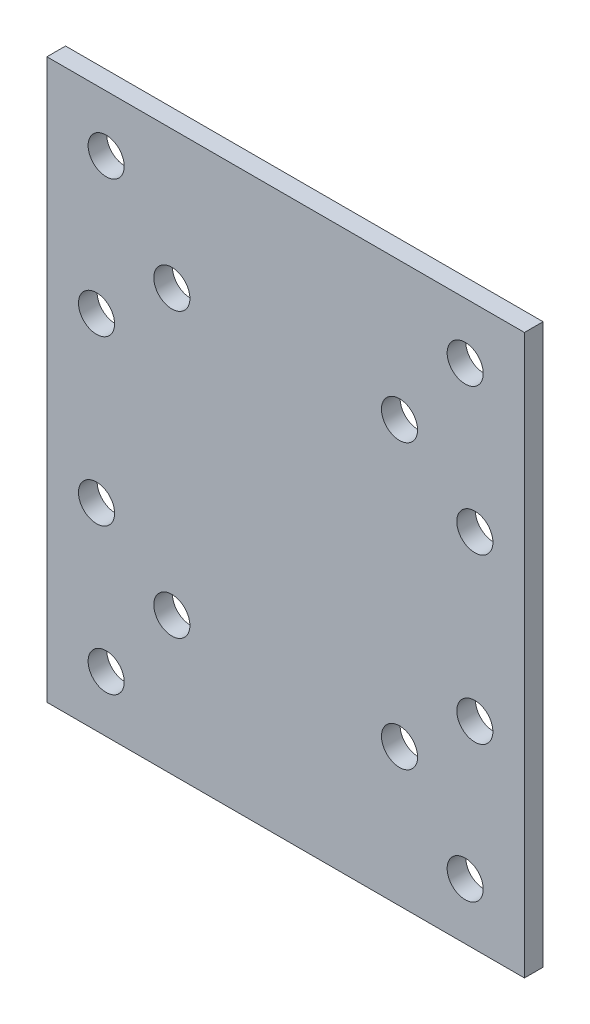
ISO-10303-21;
HEADER;
FILE_DESCRIPTION(('STEP AP214'),'2;1');
FILE_NAME('part.step','',(''),(''),'','','');
FILE_SCHEMA(('AUTOMOTIVE_DESIGN { 1 0 10303 214 1 1 1 1 }'));
ENDSEC;
DATA;
#1=APPLICATION_CONTEXT('core data for automotive mechanical design processes');
#2=APPLICATION_PROTOCOL_DEFINITION('international standard','automotive_design',2000,#1);
#3=PRODUCT_CONTEXT('',#1,'mechanical');
#4=PRODUCT('Part','Part','',(#3));
#5=PRODUCT_RELATED_PRODUCT_CATEGORY('part','',(#4));
#6=PRODUCT_DEFINITION_FORMATION('','',#4);
#7=PRODUCT_DEFINITION_CONTEXT('part definition',#1,'design');
#8=PRODUCT_DEFINITION('design','',#6,#7);
#9=PRODUCT_DEFINITION_SHAPE('','',#8);
#10=(LENGTH_UNIT() NAMED_UNIT(*) SI_UNIT(.MILLI.,.METRE.));
#11=(NAMED_UNIT(*) PLANE_ANGLE_UNIT() SI_UNIT($,.RADIAN.));
#12=(NAMED_UNIT(*) SI_UNIT($,.STERADIAN.) SOLID_ANGLE_UNIT());
#13=UNCERTAINTY_MEASURE_WITH_UNIT(LENGTH_MEASURE(1.E-05),#10,'distance_accuracy_value','');
#14=(GEOMETRIC_REPRESENTATION_CONTEXT(3) GLOBAL_UNCERTAINTY_ASSIGNED_CONTEXT((#13)) GLOBAL_UNIT_ASSIGNED_CONTEXT((#10,
#11,#12)) REPRESENTATION_CONTEXT('',''));
#15=CARTESIAN_POINT('',(0.,0.,0.));
#16=DIRECTION('',(0.,0.,1.));
#17=DIRECTION('',(1.,0.,0.));
#18=AXIS2_PLACEMENT_3D('',#15,#16,#17);
#19=CARTESIAN_POINT('',(0.,480.,16.));
#20=DIRECTION('',(0.,0.,-1.));
#21=DIRECTION('',(-1.,0.,0.));
#22=AXIS2_PLACEMENT_3D('',#19,#20,#21);
#23=PLANE('',#22);
#24=CARTESIAN_POINT('',(302.738221798083,361.586347916815,16.));
#25=DIRECTION('',(0.,0.,1.));
#26=DIRECTION('',(1.,0.,0.));
#27=AXIS2_PLACEMENT_3D('',#24,#25,#26);
#28=CIRCLE('',#27,15.5);
#29=CARTESIAN_POINT('',(318.238221798083,361.586347916815,16.));
#30=VERTEX_POINT('',#29);
#31=EDGE_CURVE('E166',#30,#30,#28,.T.);
#32=ORIENTED_EDGE('',*,*,#31,.F.);
#33=EDGE_LOOP('',(#32));
#34=FACE_BOUND('',#33,.T.);
#35=CARTESIAN_POINT('',(107.261778201917,361.586347916815,16.));
#36=DIRECTION('',(0.,0.,1.));
#37=DIRECTION('',(-1.,0.,0.));
#38=AXIS2_PLACEMENT_3D('',#35,#36,#37);
#39=CIRCLE('',#38,15.5);
#40=CARTESIAN_POINT('',(91.7617782019172,361.586347916815,16.));
#41=VERTEX_POINT('',#40);
#42=EDGE_CURVE('E154',#41,#41,#39,.T.);
#43=ORIENTED_EDGE('',*,*,#42,.F.);
#44=EDGE_LOOP('',(#43));
#45=FACE_BOUND('',#44,.T.);
#46=CARTESIAN_POINT('',(367.40218869963,169.611584010082,16.));
#47=DIRECTION('',(0.,0.,1.));
#48=DIRECTION('',(-1.,0.,0.));
#49=AXIS2_PLACEMENT_3D('',#46,#47,#48);
#50=CIRCLE('',#49,15.5);
#51=CARTESIAN_POINT('',(351.90218869963,169.611584010082,16.));
#52=VERTEX_POINT('',#51);
#53=EDGE_CURVE('E142',#52,#52,#50,.T.);
#54=ORIENTED_EDGE('',*,*,#53,.F.);
#55=EDGE_LOOP('',(#54));
#56=FACE_BOUND('',#55,.T.);
#57=CARTESIAN_POINT('',(359.125657450823,48.2676821311762,16.));
#58=DIRECTION('',(0.,0.,1.));
#59=DIRECTION('',(-1.,0.,0.));
#60=AXIS2_PLACEMENT_3D('',#57,#58,#59);
#61=CIRCLE('',#60,15.5000000000001);
#62=CARTESIAN_POINT('',(343.625657450823,48.2676821311762,16.));
#63=VERTEX_POINT('',#62);
#64=EDGE_CURVE('E130',#63,#63,#61,.T.);
#65=ORIENTED_EDGE('',*,*,#64,.F.);
#66=EDGE_LOOP('',(#65));
#67=FACE_BOUND('',#66,.T.);
#68=CARTESIAN_POINT('',(50.8743425491773,48.2676821311762,16.));
#69=DIRECTION('',(0.,0.,1.));
#70=DIRECTION('',(1.,0.,0.));
#71=AXIS2_PLACEMENT_3D('',#68,#69,#70);
#72=CIRCLE('',#71,15.5);
#73=CARTESIAN_POINT('',(66.3743425491773,48.2676821311762,16.));
#74=VERTEX_POINT('',#73);
#75=EDGE_CURVE('E118',#74,#74,#72,.T.);
#76=ORIENTED_EDGE('',*,*,#75,.F.);
#77=EDGE_LOOP('',(#76));
#78=FACE_BOUND('',#77,.T.);
#79=CARTESIAN_POINT('',(367.40218869963,310.388415989918,16.));
#80=DIRECTION('',(0.,0.,1.));
#81=DIRECTION('',(1.,0.,0.));
#82=AXIS2_PLACEMENT_3D('',#79,#80,#81);
#83=CIRCLE('',#82,15.5);
#84=CARTESIAN_POINT('',(382.90218869963,310.388415989918,16.));
#85=VERTEX_POINT('',#84);
#86=EDGE_CURVE('E97',#85,#85,#83,.T.);
#87=ORIENTED_EDGE('',*,*,#86,.F.);
#88=EDGE_LOOP('',(#87));
#89=FACE_BOUND('',#88,.T.);
#90=DIRECTION('',(0.,-1.,0.));
#91=VECTOR('',#90,1.);
#92=CARTESIAN_POINT('',(0.,0.,16.));
#93=LINE('',#92,#91);
#94=CARTESIAN_POINT('',(0.,480.,16.));
#95=VERTEX_POINT('',#94);
#96=CARTESIAN_POINT('',(0.,0.,16.));
#97=VERTEX_POINT('',#96);
#98=EDGE_CURVE('E82',#95,#97,#93,.T.);
#99=ORIENTED_EDGE('',*,*,#98,.T.);
#100=DIRECTION('',(1.,0.,0.));
#101=VECTOR('',#100,1.);
#102=CARTESIAN_POINT('',(0.,0.,16.));
#103=LINE('',#102,#101);
#104=CARTESIAN_POINT('',(410.,0.,16.));
#105=VERTEX_POINT('',#104);
#106=EDGE_CURVE('E77',#97,#105,#103,.T.);
#107=ORIENTED_EDGE('',*,*,#106,.T.);
#108=DIRECTION('',(0.,1.,0.));
#109=VECTOR('',#108,1.);
#110=CARTESIAN_POINT('',(410.,0.,16.));
#111=LINE('',#110,#109);
#112=CARTESIAN_POINT('',(410.,480.,16.));
#113=VERTEX_POINT('',#112);
#114=EDGE_CURVE('E80',#105,#113,#111,.T.);
#115=ORIENTED_EDGE('',*,*,#114,.T.);
#116=DIRECTION('',(-1.,0.,0.));
#117=VECTOR('',#116,1.);
#118=CARTESIAN_POINT('',(0.,480.,16.));
#119=LINE('',#118,#117);
#120=EDGE_CURVE('E47',#113,#95,#119,.T.);
#121=ORIENTED_EDGE('',*,*,#120,.T.);
#122=EDGE_LOOP('',(#99,#107,#115,#121));
#123=FACE_BOUND('',#122,.T.);
#124=CARTESIAN_POINT('',(107.261778201917,118.413652083185,16.));
#125=DIRECTION('',(0.,0.,1.));
#126=DIRECTION('',(1.,0.,0.));
#127=AXIS2_PLACEMENT_3D('',#124,#125,#126);
#128=CIRCLE('',#127,15.5);
#129=CARTESIAN_POINT('',(122.761778201917,118.413652083185,16.));
#130=VERTEX_POINT('',#129);
#131=EDGE_CURVE('E112',#130,#130,#128,.T.);
#132=ORIENTED_EDGE('',*,*,#131,.F.);
#133=EDGE_LOOP('',(#132));
#134=FACE_BOUND('',#133,.T.);
#135=CARTESIAN_POINT('',(42.5978113003698,310.388415989918,16.));
#136=DIRECTION('',(0.,0.,1.));
#137=DIRECTION('',(-1.,0.,0.));
#138=AXIS2_PLACEMENT_3D('',#135,#136,#137);
#139=CIRCLE('',#138,15.5);
#140=CARTESIAN_POINT('',(27.0978113003698,310.388415989918,16.));
#141=VERTEX_POINT('',#140);
#142=EDGE_CURVE('E124',#141,#141,#139,.T.);
#143=ORIENTED_EDGE('',*,*,#142,.F.);
#144=EDGE_LOOP('',(#143));
#145=FACE_BOUND('',#144,.T.);
#146=CARTESIAN_POINT('',(302.738221798083,118.413652083185,16.));
#147=DIRECTION('',(0.,0.,1.));
#148=DIRECTION('',(-1.,0.,0.));
#149=AXIS2_PLACEMENT_3D('',#146,#147,#148);
#150=CIRCLE('',#149,15.5);
#151=CARTESIAN_POINT('',(287.238221798083,118.413652083185,16.));
#152=VERTEX_POINT('',#151);
#153=EDGE_CURVE('E136',#152,#152,#150,.T.);
#154=ORIENTED_EDGE('',*,*,#153,.F.);
#155=EDGE_LOOP('',(#154));
#156=FACE_BOUND('',#155,.T.);
#157=CARTESIAN_POINT('',(50.8743425491773,431.732317868824,16.));
#158=DIRECTION('',(0.,0.,1.));
#159=DIRECTION('',(-1.,0.,0.));
#160=AXIS2_PLACEMENT_3D('',#157,#158,#159);
#161=CIRCLE('',#160,15.5);
#162=CARTESIAN_POINT('',(35.3743425491773,431.732317868824,16.));
#163=VERTEX_POINT('',#162);
#164=EDGE_CURVE('E148',#163,#163,#161,.T.);
#165=ORIENTED_EDGE('',*,*,#164,.F.);
#166=EDGE_LOOP('',(#165));
#167=FACE_BOUND('',#166,.T.);
#168=CARTESIAN_POINT('',(42.5978113003698,169.611584010082,16.));
#169=DIRECTION('',(0.,0.,1.));
#170=DIRECTION('',(1.,0.,0.));
#171=AXIS2_PLACEMENT_3D('',#168,#169,#170);
#172=CIRCLE('',#171,15.5);
#173=CARTESIAN_POINT('',(58.0978113003698,169.611584010082,16.));
#174=VERTEX_POINT('',#173);
#175=EDGE_CURVE('E160',#174,#174,#172,.T.);
#176=ORIENTED_EDGE('',*,*,#175,.F.);
#177=EDGE_LOOP('',(#176));
#178=FACE_BOUND('',#177,.T.);
#179=CARTESIAN_POINT('',(359.125657450823,431.732317868824,16.));
#180=DIRECTION('',(0.,0.,1.));
#181=DIRECTION('',(1.,0.,0.));
#182=AXIS2_PLACEMENT_3D('',#179,#180,#181);
#183=CIRCLE('',#182,15.5000000000001);
#184=CARTESIAN_POINT('',(374.625657450823,431.732317868824,16.));
#185=VERTEX_POINT('',#184);
#186=EDGE_CURVE('E172',#185,#185,#183,.T.);
#187=ORIENTED_EDGE('',*,*,#186,.F.);
#188=EDGE_LOOP('',(#187));
#189=FACE_BOUND('',#188,.T.);
#190=ADVANCED_FACE('F30',(#34,#45,#56,#67,#78,#89,#123,#134,#145,#156,#167,#178,#189),#23,.F.);
#191=CARTESIAN_POINT('',(0.,480.,0.));
#192=DIRECTION('',(0.,0.,-1.));
#193=DIRECTION('',(-1.,0.,0.));
#194=AXIS2_PLACEMENT_3D('',#191,#192,#193);
#195=PLANE('',#194);
#196=CARTESIAN_POINT('',(302.738221798083,361.586347916815,0.));
#197=DIRECTION('',(0.,0.,1.));
#198=DIRECTION('',(1.,0.,0.));
#199=AXIS2_PLACEMENT_3D('',#196,#197,#198);
#200=CIRCLE('',#199,15.5);
#201=CARTESIAN_POINT('',(318.238221798083,361.586347916815,0.));
#202=VERTEX_POINT('',#201);
#203=EDGE_CURVE('E169',#202,#202,#200,.T.);
#204=ORIENTED_EDGE('',*,*,#203,.T.);
#205=EDGE_LOOP('',(#204));
#206=FACE_BOUND('',#205,.T.);
#207=CARTESIAN_POINT('',(107.261778201917,361.586347916815,0.));
#208=DIRECTION('',(0.,0.,1.));
#209=DIRECTION('',(-1.,0.,0.));
#210=AXIS2_PLACEMENT_3D('',#207,#208,#209);
#211=CIRCLE('',#210,15.5);
#212=CARTESIAN_POINT('',(91.7617782019172,361.586347916815,0.));
#213=VERTEX_POINT('',#212);
#214=EDGE_CURVE('E157',#213,#213,#211,.T.);
#215=ORIENTED_EDGE('',*,*,#214,.T.);
#216=EDGE_LOOP('',(#215));
#217=FACE_BOUND('',#216,.T.);
#218=CARTESIAN_POINT('',(367.40218869963,169.611584010082,0.));
#219=DIRECTION('',(0.,0.,1.));
#220=DIRECTION('',(-1.,0.,0.));
#221=AXIS2_PLACEMENT_3D('',#218,#219,#220);
#222=CIRCLE('',#221,15.5);
#223=CARTESIAN_POINT('',(351.90218869963,169.611584010082,0.));
#224=VERTEX_POINT('',#223);
#225=EDGE_CURVE('E145',#224,#224,#222,.T.);
#226=ORIENTED_EDGE('',*,*,#225,.T.);
#227=EDGE_LOOP('',(#226));
#228=FACE_BOUND('',#227,.T.);
#229=CARTESIAN_POINT('',(359.125657450823,48.2676821311762,0.));
#230=DIRECTION('',(0.,0.,1.));
#231=DIRECTION('',(-1.,0.,0.));
#232=AXIS2_PLACEMENT_3D('',#229,#230,#231);
#233=CIRCLE('',#232,15.5000000000001);
#234=CARTESIAN_POINT('',(343.625657450823,48.2676821311762,0.));
#235=VERTEX_POINT('',#234);
#236=EDGE_CURVE('E133',#235,#235,#233,.T.);
#237=ORIENTED_EDGE('',*,*,#236,.T.);
#238=EDGE_LOOP('',(#237));
#239=FACE_BOUND('',#238,.T.);
#240=CARTESIAN_POINT('',(50.8743425491773,48.2676821311762,0.));
#241=DIRECTION('',(0.,0.,1.));
#242=DIRECTION('',(1.,0.,0.));
#243=AXIS2_PLACEMENT_3D('',#240,#241,#242);
#244=CIRCLE('',#243,15.5);
#245=CARTESIAN_POINT('',(66.3743425491773,48.2676821311762,0.));
#246=VERTEX_POINT('',#245);
#247=EDGE_CURVE('E121',#246,#246,#244,.T.);
#248=ORIENTED_EDGE('',*,*,#247,.T.);
#249=EDGE_LOOP('',(#248));
#250=FACE_BOUND('',#249,.T.);
#251=CARTESIAN_POINT('',(367.40218869963,310.388415989918,0.));
#252=DIRECTION('',(0.,0.,1.));
#253=DIRECTION('',(1.,0.,0.));
#254=AXIS2_PLACEMENT_3D('',#251,#252,#253);
#255=CIRCLE('',#254,15.5);
#256=CARTESIAN_POINT('',(382.90218869963,310.388415989918,0.));
#257=VERTEX_POINT('',#256);
#258=EDGE_CURVE('E109',#257,#257,#255,.T.);
#259=ORIENTED_EDGE('',*,*,#258,.T.);
#260=EDGE_LOOP('',(#259));
#261=FACE_BOUND('',#260,.T.);
#262=DIRECTION('',(0.,-1.,0.));
#263=VECTOR('',#262,1.);
#264=CARTESIAN_POINT('',(0.,0.,0.));
#265=LINE('',#264,#263);
#266=CARTESIAN_POINT('',(0.,480.,0.));
#267=VERTEX_POINT('',#266);
#268=CARTESIAN_POINT('',(0.,0.,0.));
#269=VERTEX_POINT('',#268);
#270=EDGE_CURVE('E94',#267,#269,#265,.T.);
#271=ORIENTED_EDGE('',*,*,#270,.F.);
#272=DIRECTION('',(-1.,0.,0.));
#273=VECTOR('',#272,1.);
#274=CARTESIAN_POINT('',(0.,480.,0.));
#275=LINE('',#274,#273);
#276=CARTESIAN_POINT('',(410.,480.,0.));
#277=VERTEX_POINT('',#276);
#278=EDGE_CURVE('E70',#277,#267,#275,.T.);
#279=ORIENTED_EDGE('',*,*,#278,.F.);
#280=DIRECTION('',(0.,1.,0.));
#281=VECTOR('',#280,1.);
#282=CARTESIAN_POINT('',(410.,0.,0.));
#283=LINE('',#282,#281);
#284=CARTESIAN_POINT('',(410.,0.,0.));
#285=VERTEX_POINT('',#284);
#286=EDGE_CURVE('E64',#285,#277,#283,.T.);
#287=ORIENTED_EDGE('',*,*,#286,.F.);
#288=DIRECTION('',(1.,0.,0.));
#289=VECTOR('',#288,1.);
#290=CARTESIAN_POINT('',(0.,0.,0.));
#291=LINE('',#290,#289);
#292=EDGE_CURVE('E86',#269,#285,#291,.T.);
#293=ORIENTED_EDGE('',*,*,#292,.F.);
#294=EDGE_LOOP('',(#271,#279,#287,#293));
#295=FACE_BOUND('',#294,.T.);
#296=CARTESIAN_POINT('',(107.261778201917,118.413652083185,0.));
#297=DIRECTION('',(0.,0.,1.));
#298=DIRECTION('',(1.,0.,0.));
#299=AXIS2_PLACEMENT_3D('',#296,#297,#298);
#300=CIRCLE('',#299,15.5);
#301=CARTESIAN_POINT('',(122.761778201917,118.413652083185,0.));
#302=VERTEX_POINT('',#301);
#303=EDGE_CURVE('E115',#302,#302,#300,.T.);
#304=ORIENTED_EDGE('',*,*,#303,.T.);
#305=EDGE_LOOP('',(#304));
#306=FACE_BOUND('',#305,.T.);
#307=CARTESIAN_POINT('',(42.5978113003698,310.388415989918,0.));
#308=DIRECTION('',(0.,0.,1.));
#309=DIRECTION('',(-1.,0.,0.));
#310=AXIS2_PLACEMENT_3D('',#307,#308,#309);
#311=CIRCLE('',#310,15.5);
#312=CARTESIAN_POINT('',(27.0978113003698,310.388415989918,0.));
#313=VERTEX_POINT('',#312);
#314=EDGE_CURVE('E127',#313,#313,#311,.T.);
#315=ORIENTED_EDGE('',*,*,#314,.T.);
#316=EDGE_LOOP('',(#315));
#317=FACE_BOUND('',#316,.T.);
#318=CARTESIAN_POINT('',(302.738221798083,118.413652083185,0.));
#319=DIRECTION('',(0.,0.,1.));
#320=DIRECTION('',(-1.,0.,0.));
#321=AXIS2_PLACEMENT_3D('',#318,#319,#320);
#322=CIRCLE('',#321,15.5);
#323=CARTESIAN_POINT('',(287.238221798083,118.413652083185,0.));
#324=VERTEX_POINT('',#323);
#325=EDGE_CURVE('E139',#324,#324,#322,.T.);
#326=ORIENTED_EDGE('',*,*,#325,.T.);
#327=EDGE_LOOP('',(#326));
#328=FACE_BOUND('',#327,.T.);
#329=CARTESIAN_POINT('',(50.8743425491773,431.732317868824,0.));
#330=DIRECTION('',(0.,0.,1.));
#331=DIRECTION('',(-1.,0.,0.));
#332=AXIS2_PLACEMENT_3D('',#329,#330,#331);
#333=CIRCLE('',#332,15.5);
#334=CARTESIAN_POINT('',(35.3743425491773,431.732317868824,0.));
#335=VERTEX_POINT('',#334);
#336=EDGE_CURVE('E151',#335,#335,#333,.T.);
#337=ORIENTED_EDGE('',*,*,#336,.T.);
#338=EDGE_LOOP('',(#337));
#339=FACE_BOUND('',#338,.T.);
#340=CARTESIAN_POINT('',(42.5978113003698,169.611584010082,0.));
#341=DIRECTION('',(0.,0.,1.));
#342=DIRECTION('',(1.,0.,0.));
#343=AXIS2_PLACEMENT_3D('',#340,#341,#342);
#344=CIRCLE('',#343,15.5);
#345=CARTESIAN_POINT('',(58.0978113003698,169.611584010082,0.));
#346=VERTEX_POINT('',#345);
#347=EDGE_CURVE('E163',#346,#346,#344,.T.);
#348=ORIENTED_EDGE('',*,*,#347,.T.);
#349=EDGE_LOOP('',(#348));
#350=FACE_BOUND('',#349,.T.);
#351=CARTESIAN_POINT('',(359.125657450823,431.732317868824,0.));
#352=DIRECTION('',(0.,0.,1.));
#353=DIRECTION('',(1.,0.,0.));
#354=AXIS2_PLACEMENT_3D('',#351,#352,#353);
#355=CIRCLE('',#354,15.5000000000001);
#356=CARTESIAN_POINT('',(374.625657450823,431.732317868824,0.));
#357=VERTEX_POINT('',#356);
#358=EDGE_CURVE('E175',#357,#357,#355,.T.);
#359=ORIENTED_EDGE('',*,*,#358,.T.);
#360=EDGE_LOOP('',(#359));
#361=FACE_BOUND('',#360,.T.);
#362=ADVANCED_FACE('F105',(#206,#217,#228,#239,#250,#261,#295,#306,#317,#328,#339,#350,#361),
#195,.T.);
#363=CARTESIAN_POINT('',(0.,0.,16.));
#364=DIRECTION('',(1.,0.,0.));
#365=DIRECTION('',(0.,0.,-1.));
#366=AXIS2_PLACEMENT_3D('',#363,#364,#365);
#367=PLANE('',#366);
#368=ORIENTED_EDGE('',*,*,#270,.T.);
#369=DIRECTION('',(0.,0.,-1.));
#370=VECTOR('',#369,1.);
#371=CARTESIAN_POINT('',(0.,0.,16.));
#372=LINE('',#371,#370);
#373=EDGE_CURVE('E11',#97,#269,#372,.T.);
#374=ORIENTED_EDGE('',*,*,#373,.F.);
#375=ORIENTED_EDGE('',*,*,#98,.F.);
#376=DIRECTION('',(0.,0.,-1.));
#377=VECTOR('',#376,1.);
#378=CARTESIAN_POINT('',(0.,480.,16.));
#379=LINE('',#378,#377);
#380=EDGE_CURVE('E90',#95,#267,#379,.T.);
#381=ORIENTED_EDGE('',*,*,#380,.T.);
#382=EDGE_LOOP('',(#368,#374,#375,#381));
#383=FACE_BOUND('',#382,.T.);
#384=ADVANCED_FACE('F32',(#383),#367,.F.);
#385=CARTESIAN_POINT('',(0.,0.,16.));
#386=DIRECTION('',(0.,1.,0.));
#387=DIRECTION('',(0.,0.,1.));
#388=AXIS2_PLACEMENT_3D('',#385,#386,#387);
#389=PLANE('',#388);
#390=ORIENTED_EDGE('',*,*,#292,.T.);
#391=DIRECTION('',(0.,0.,-1.));
#392=VECTOR('',#391,1.);
#393=CARTESIAN_POINT('',(410.,0.,16.));
#394=LINE('',#393,#392);
#395=EDGE_CURVE('E39',#105,#285,#394,.T.);
#396=ORIENTED_EDGE('',*,*,#395,.F.);
#397=ORIENTED_EDGE('',*,*,#106,.F.);
#398=ORIENTED_EDGE('',*,*,#373,.T.);
#399=EDGE_LOOP('',(#390,#396,#397,#398));
#400=FACE_BOUND('',#399,.T.);
#401=ADVANCED_FACE('F85',(#400),#389,.F.);
#402=CARTESIAN_POINT('',(410.,0.,16.));
#403=DIRECTION('',(-1.,0.,0.));
#404=DIRECTION('',(0.,0.,1.));
#405=AXIS2_PLACEMENT_3D('',#402,#403,#404);
#406=PLANE('',#405);
#407=ORIENTED_EDGE('',*,*,#286,.T.);
#408=DIRECTION('',(0.,0.,-1.));
#409=VECTOR('',#408,1.);
#410=CARTESIAN_POINT('',(410.,480.,16.));
#411=LINE('',#410,#409);
#412=EDGE_CURVE('E87',#113,#277,#411,.T.);
#413=ORIENTED_EDGE('',*,*,#412,.F.);
#414=ORIENTED_EDGE('',*,*,#114,.F.);
#415=ORIENTED_EDGE('',*,*,#395,.T.);
#416=EDGE_LOOP('',(#407,#413,#414,#415));
#417=FACE_BOUND('',#416,.T.);
#418=ADVANCED_FACE('F88',(#417),#406,.F.);
#419=CARTESIAN_POINT('',(0.,480.,16.));
#420=DIRECTION('',(0.,-1.,0.));
#421=DIRECTION('',(0.,0.,-1.));
#422=AXIS2_PLACEMENT_3D('',#419,#420,#421);
#423=PLANE('',#422);
#424=ORIENTED_EDGE('',*,*,#278,.T.);
#425=ORIENTED_EDGE('',*,*,#380,.F.);
#426=ORIENTED_EDGE('',*,*,#120,.F.);
#427=ORIENTED_EDGE('',*,*,#412,.T.);
#428=EDGE_LOOP('',(#424,#425,#426,#427));
#429=FACE_BOUND('',#428,.T.);
#430=ADVANCED_FACE('F102',(#429),#423,.F.);
#431=CARTESIAN_POINT('',(367.40218869963,310.388415989918,16.));
#432=DIRECTION('',(0.,0.,-1.));
#433=DIRECTION('',(-1.,0.,0.));
#434=AXIS2_PLACEMENT_3D('',#431,#432,#433);
#435=CYLINDRICAL_SURFACE('',#434,15.5);
#436=ORIENTED_EDGE('',*,*,#86,.T.);
#437=EDGE_LOOP('',(#436));
#438=FACE_BOUND('',#437,.T.);
#439=ORIENTED_EDGE('',*,*,#258,.F.);
#440=EDGE_LOOP('',(#439));
#441=FACE_BOUND('',#440,.T.);
#442=ADVANCED_FACE('F195',(#438,#441),#435,.F.);
#443=CARTESIAN_POINT('',(107.261778201917,118.413652083185,16.));
#444=DIRECTION('',(0.,0.,-1.));
#445=DIRECTION('',(-1.,0.,0.));
#446=AXIS2_PLACEMENT_3D('',#443,#444,#445);
#447=CYLINDRICAL_SURFACE('',#446,15.5);
#448=ORIENTED_EDGE('',*,*,#131,.T.);
#449=EDGE_LOOP('',(#448));
#450=FACE_BOUND('',#449,.T.);
#451=ORIENTED_EDGE('',*,*,#303,.F.);
#452=EDGE_LOOP('',(#451));
#453=FACE_BOUND('',#452,.T.);
#454=ADVANCED_FACE('F241',(#450,#453),#447,.F.);
#455=CARTESIAN_POINT('',(50.8743425491773,48.2676821311762,16.));
#456=DIRECTION('',(0.,0.,-1.));
#457=DIRECTION('',(-1.,0.,0.));
#458=AXIS2_PLACEMENT_3D('',#455,#456,#457);
#459=CYLINDRICAL_SURFACE('',#458,15.5);
#460=ORIENTED_EDGE('',*,*,#75,.T.);
#461=EDGE_LOOP('',(#460));
#462=FACE_BOUND('',#461,.T.);
#463=ORIENTED_EDGE('',*,*,#247,.F.);
#464=EDGE_LOOP('',(#463));
#465=FACE_BOUND('',#464,.T.);
#466=ADVANCED_FACE('F249',(#462,#465),#459,.F.);
#467=CARTESIAN_POINT('',(42.5978113003698,310.388415989918,16.));
#468=DIRECTION('',(0.,0.,-1.));
#469=DIRECTION('',(-1.,0.,0.));
#470=AXIS2_PLACEMENT_3D('',#467,#468,#469);
#471=CYLINDRICAL_SURFACE('',#470,15.5);
#472=ORIENTED_EDGE('',*,*,#142,.T.);
#473=EDGE_LOOP('',(#472));
#474=FACE_BOUND('',#473,.T.);
#475=ORIENTED_EDGE('',*,*,#314,.F.);
#476=EDGE_LOOP('',(#475));
#477=FACE_BOUND('',#476,.T.);
#478=ADVANCED_FACE('F257',(#474,#477),#471,.F.);
#479=CARTESIAN_POINT('',(359.125657450823,48.2676821311762,16.));
#480=DIRECTION('',(0.,0.,-1.));
#481=DIRECTION('',(-1.,0.,0.));
#482=AXIS2_PLACEMENT_3D('',#479,#480,#481);
#483=CYLINDRICAL_SURFACE('',#482,15.5000000000001);
#484=ORIENTED_EDGE('',*,*,#64,.T.);
#485=EDGE_LOOP('',(#484));
#486=FACE_BOUND('',#485,.T.);
#487=ORIENTED_EDGE('',*,*,#236,.F.);
#488=EDGE_LOOP('',(#487));
#489=FACE_BOUND('',#488,.T.);
#490=ADVANCED_FACE('F266',(#486,#489),#483,.F.);
#491=CARTESIAN_POINT('',(302.738221798083,118.413652083185,16.));
#492=DIRECTION('',(0.,0.,-1.));
#493=DIRECTION('',(-1.,0.,0.));
#494=AXIS2_PLACEMENT_3D('',#491,#492,#493);
#495=CYLINDRICAL_SURFACE('',#494,15.5);
#496=ORIENTED_EDGE('',*,*,#153,.T.);
#497=EDGE_LOOP('',(#496));
#498=FACE_BOUND('',#497,.T.);
#499=ORIENTED_EDGE('',*,*,#325,.F.);
#500=EDGE_LOOP('',(#499));
#501=FACE_BOUND('',#500,.T.);
#502=ADVANCED_FACE('F275',(#498,#501),#495,.F.);
#503=CARTESIAN_POINT('',(367.40218869963,169.611584010082,16.));
#504=DIRECTION('',(0.,0.,-1.));
#505=DIRECTION('',(-1.,0.,0.));
#506=AXIS2_PLACEMENT_3D('',#503,#504,#505);
#507=CYLINDRICAL_SURFACE('',#506,15.5);
#508=ORIENTED_EDGE('',*,*,#53,.T.);
#509=EDGE_LOOP('',(#508));
#510=FACE_BOUND('',#509,.T.);
#511=ORIENTED_EDGE('',*,*,#225,.F.);
#512=EDGE_LOOP('',(#511));
#513=FACE_BOUND('',#512,.T.);
#514=ADVANCED_FACE('F284',(#510,#513),#507,.F.);
#515=CARTESIAN_POINT('',(50.8743425491773,431.732317868824,16.));
#516=DIRECTION('',(0.,0.,-1.));
#517=DIRECTION('',(-1.,0.,0.));
#518=AXIS2_PLACEMENT_3D('',#515,#516,#517);
#519=CYLINDRICAL_SURFACE('',#518,15.5);
#520=ORIENTED_EDGE('',*,*,#164,.T.);
#521=EDGE_LOOP('',(#520));
#522=FACE_BOUND('',#521,.T.);
#523=ORIENTED_EDGE('',*,*,#336,.F.);
#524=EDGE_LOOP('',(#523));
#525=FACE_BOUND('',#524,.T.);
#526=ADVANCED_FACE('F293',(#522,#525),#519,.F.);
#527=CARTESIAN_POINT('',(107.261778201917,361.586347916815,16.));
#528=DIRECTION('',(0.,0.,-1.));
#529=DIRECTION('',(-1.,0.,0.));
#530=AXIS2_PLACEMENT_3D('',#527,#528,#529);
#531=CYLINDRICAL_SURFACE('',#530,15.5);
#532=ORIENTED_EDGE('',*,*,#42,.T.);
#533=EDGE_LOOP('',(#532));
#534=FACE_BOUND('',#533,.T.);
#535=ORIENTED_EDGE('',*,*,#214,.F.);
#536=EDGE_LOOP('',(#535));
#537=FACE_BOUND('',#536,.T.);
#538=ADVANCED_FACE('F302',(#534,#537),#531,.F.);
#539=CARTESIAN_POINT('',(42.5978113003698,169.611584010082,16.));
#540=DIRECTION('',(0.,0.,-1.));
#541=DIRECTION('',(-1.,0.,0.));
#542=AXIS2_PLACEMENT_3D('',#539,#540,#541);
#543=CYLINDRICAL_SURFACE('',#542,15.5);
#544=ORIENTED_EDGE('',*,*,#175,.T.);
#545=EDGE_LOOP('',(#544));
#546=FACE_BOUND('',#545,.T.);
#547=ORIENTED_EDGE('',*,*,#347,.F.);
#548=EDGE_LOOP('',(#547));
#549=FACE_BOUND('',#548,.T.);
#550=ADVANCED_FACE('F311',(#546,#549),#543,.F.);
#551=CARTESIAN_POINT('',(302.738221798083,361.586347916815,16.));
#552=DIRECTION('',(0.,0.,-1.));
#553=DIRECTION('',(-1.,0.,0.));
#554=AXIS2_PLACEMENT_3D('',#551,#552,#553);
#555=CYLINDRICAL_SURFACE('',#554,15.5);
#556=ORIENTED_EDGE('',*,*,#31,.T.);
#557=EDGE_LOOP('',(#556));
#558=FACE_BOUND('',#557,.T.);
#559=ORIENTED_EDGE('',*,*,#203,.F.);
#560=EDGE_LOOP('',(#559));
#561=FACE_BOUND('',#560,.T.);
#562=ADVANCED_FACE('F320',(#558,#561),#555,.F.);
#563=CARTESIAN_POINT('',(359.125657450823,431.732317868824,16.));
#564=DIRECTION('',(0.,0.,-1.));
#565=DIRECTION('',(-1.,0.,0.));
#566=AXIS2_PLACEMENT_3D('',#563,#564,#565);
#567=CYLINDRICAL_SURFACE('',#566,15.5000000000001);
#568=ORIENTED_EDGE('',*,*,#186,.T.);
#569=EDGE_LOOP('',(#568));
#570=FACE_BOUND('',#569,.T.);
#571=ORIENTED_EDGE('',*,*,#358,.F.);
#572=EDGE_LOOP('',(#571));
#573=FACE_BOUND('',#572,.T.);
#574=ADVANCED_FACE('F181',(#570,#573),#567,.F.);
#575=CLOSED_SHELL('',(#190,#362,#384,#401,#418,#430,#442,#454,#466,#478,#490,#502,#514,#526,
#538,#550,#562,#574));
#576=MANIFOLD_SOLID_BREP('B2',#575);
#577=ADVANCED_BREP_SHAPE_REPRESENTATION('',(#18,#576),#14);
#578=SHAPE_DEFINITION_REPRESENTATION(#9,#577);
ENDSEC;
END-ISO-10303-21;
